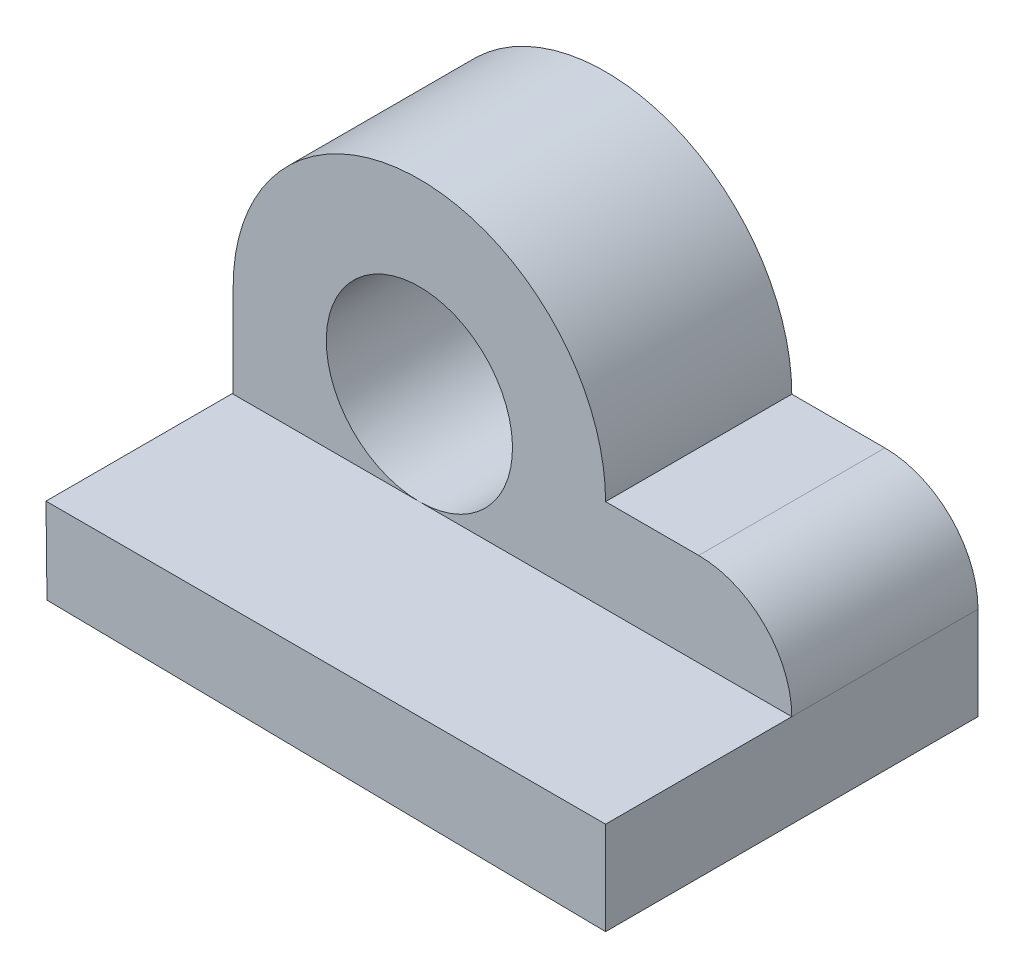
ISO-10303-21;
HEADER;
FILE_DESCRIPTION(('STEP AP214'),'2;1');
FILE_NAME('part.step','',(''),(''),'','','');
FILE_SCHEMA(('AUTOMOTIVE_DESIGN { 1 0 10303 214 1 1 1 1 }'));
ENDSEC;
DATA;
#1=APPLICATION_CONTEXT('core data for automotive mechanical design processes');
#2=APPLICATION_PROTOCOL_DEFINITION('international standard','automotive_design',2000,#1);
#3=PRODUCT_CONTEXT('',#1,'mechanical');
#4=PRODUCT('Part','Part','',(#3));
#5=PRODUCT_RELATED_PRODUCT_CATEGORY('part','',(#4));
#6=PRODUCT_DEFINITION_FORMATION('','',#4);
#7=PRODUCT_DEFINITION_CONTEXT('part definition',#1,'design');
#8=PRODUCT_DEFINITION('design','',#6,#7);
#9=PRODUCT_DEFINITION_SHAPE('','',#8);
#10=(LENGTH_UNIT() NAMED_UNIT(*) SI_UNIT(.MILLI.,.METRE.));
#11=(NAMED_UNIT(*) PLANE_ANGLE_UNIT() SI_UNIT($,.RADIAN.));
#12=(NAMED_UNIT(*) SI_UNIT($,.STERADIAN.) SOLID_ANGLE_UNIT());
#13=UNCERTAINTY_MEASURE_WITH_UNIT(LENGTH_MEASURE(1.E-05),#10,'distance_accuracy_value','');
#14=(GEOMETRIC_REPRESENTATION_CONTEXT(3) GLOBAL_UNCERTAINTY_ASSIGNED_CONTEXT((#13)) GLOBAL_UNIT_ASSIGNED_CONTEXT((#10,
#11,#12)) REPRESENTATION_CONTEXT('',''));
#15=CARTESIAN_POINT('',(0.,0.,0.));
#16=DIRECTION('',(0.,0.,1.));
#17=DIRECTION('',(1.,0.,0.));
#18=AXIS2_PLACEMENT_3D('',#15,#16,#17);
#19=CARTESIAN_POINT('',(0.,0.,20.));
#20=DIRECTION('',(0.,0.,1.));
#21=DIRECTION('',(1.,0.,0.));
#22=AXIS2_PLACEMENT_3D('',#19,#20,#21);
#23=PLANE('',#22);
#24=DIRECTION('',(-1.,0.,0.));
#25=VECTOR('',#24,1.);
#26=CARTESIAN_POINT('',(-20.1042367711844,-10.,20.));
#27=LINE('',#26,#25);
#28=CARTESIAN_POINT('',(40.,-10.0000000000001,20.));
#29=VERTEX_POINT('',#28);
#30=CARTESIAN_POINT('',(0.,-10.,20.));
#31=VERTEX_POINT('',#30);
#32=EDGE_CURVE('E50',#29,#31,#27,.T.);
#33=ORIENTED_EDGE('',*,*,#32,.F.);
#34=CARTESIAN_POINT('',(30.,-10.,20.));
#35=DIRECTION('',(0.,0.,1.));
#36=DIRECTION('',(1.,0.,0.));
#37=AXIS2_PLACEMENT_3D('',#34,#35,#36);
#38=CIRCLE('',#37,10.);
#39=CARTESIAN_POINT('',(29.9999999999999,0.,20.));
#40=VERTEX_POINT('',#39);
#41=EDGE_CURVE('E108',#29,#40,#38,.T.);
#42=ORIENTED_EDGE('',*,*,#41,.T.);
#43=DIRECTION('',(-1.,0.,0.));
#44=VECTOR('',#43,1.);
#45=CARTESIAN_POINT('',(20.,0.,20.));
#46=LINE('',#45,#44);
#47=CARTESIAN_POINT('',(20.,0.,20.));
#48=VERTEX_POINT('',#47);
#49=EDGE_CURVE('E64',#40,#48,#46,.T.);
#50=ORIENTED_EDGE('',*,*,#49,.T.);
#51=CARTESIAN_POINT('',(0.,0.,20.));
#52=DIRECTION('',(0.,0.,1.));
#53=DIRECTION('',(1.,0.,0.));
#54=AXIS2_PLACEMENT_3D('',#51,#52,#53);
#55=CIRCLE('',#54,20.);
#56=CARTESIAN_POINT('',(-20.,-1.39659253553725E-13,20.));
#57=VERTEX_POINT('',#56);
#58=EDGE_CURVE('E158',#48,#57,#55,.T.);
#59=ORIENTED_EDGE('',*,*,#58,.T.);
#60=DIRECTION('',(0.,-1.,0.));
#61=VECTOR('',#60,1.);
#62=CARTESIAN_POINT('',(-20.,-1.39659253553725E-13,20.));
#63=LINE('',#62,#61);
#64=CARTESIAN_POINT('',(-20.,-10.,20.));
#65=VERTEX_POINT('',#64);
#66=EDGE_CURVE('E99',#57,#65,#63,.T.);
#67=ORIENTED_EDGE('',*,*,#66,.T.);
#68=EDGE_CURVE('E11',#31,#65,#27,.T.);
#69=ORIENTED_EDGE('',*,*,#68,.F.);
#70=CARTESIAN_POINT('',(0.,0.,20.));
#71=DIRECTION('',(0.,0.,1.));
#72=DIRECTION('',(1.,0.,0.));
#73=AXIS2_PLACEMENT_3D('',#70,#71,#72);
#74=CIRCLE('',#73,10.);
#75=EDGE_CURVE('E110',#31,#31,#74,.T.);
#76=ORIENTED_EDGE('',*,*,#75,.F.);
#77=EDGE_LOOP('',(#33,#42,#50,#59,#67,#69,#76));
#78=FACE_BOUND('',#77,.T.);
#79=ADVANCED_FACE('F39',(#78),#23,.T.);
#80=CARTESIAN_POINT('',(0.,0.,0.));
#81=DIRECTION('',(0.,0.,1.));
#82=DIRECTION('',(1.,0.,0.));
#83=AXIS2_PLACEMENT_3D('',#80,#81,#82);
#84=PLANE('',#83);
#85=CARTESIAN_POINT('',(0.,0.,0.));
#86=DIRECTION('',(0.,0.,1.));
#87=DIRECTION('',(1.,0.,0.));
#88=AXIS2_PLACEMENT_3D('',#85,#86,#87);
#89=CIRCLE('',#88,20.);
#90=CARTESIAN_POINT('',(20.,0.,0.));
#91=VERTEX_POINT('',#90);
#92=CARTESIAN_POINT('',(-20.,-1.39659253553725E-13,0.));
#93=VERTEX_POINT('',#92);
#94=EDGE_CURVE('E154',#91,#93,#89,.T.);
#95=ORIENTED_EDGE('',*,*,#94,.F.);
#96=DIRECTION('',(-1.,0.,0.));
#97=VECTOR('',#96,1.);
#98=CARTESIAN_POINT('',(20.,0.,0.));
#99=LINE('',#98,#97);
#100=CARTESIAN_POINT('',(29.9999999999999,0.,0.));
#101=VERTEX_POINT('',#100);
#102=EDGE_CURVE('E91',#101,#91,#99,.T.);
#103=ORIENTED_EDGE('',*,*,#102,.F.);
#104=CARTESIAN_POINT('',(30.,-10.,0.));
#105=DIRECTION('',(0.,0.,1.));
#106=DIRECTION('',(1.,0.,0.));
#107=AXIS2_PLACEMENT_3D('',#104,#105,#106);
#108=CIRCLE('',#107,10.);
#109=CARTESIAN_POINT('',(40.,-10.0000000000001,0.));
#110=VERTEX_POINT('',#109);
#111=EDGE_CURVE('E178',#110,#101,#108,.T.);
#112=ORIENTED_EDGE('',*,*,#111,.F.);
#113=DIRECTION('',(0.,1.,0.));
#114=VECTOR('',#113,1.);
#115=CARTESIAN_POINT('',(40.,-10.0000000000001,0.));
#116=LINE('',#115,#114);
#117=CARTESIAN_POINT('',(40.,-20.,0.));
#118=VERTEX_POINT('',#117);
#119=EDGE_CURVE('E126',#118,#110,#116,.T.);
#120=ORIENTED_EDGE('',*,*,#119,.F.);
#121=DIRECTION('',(0.999902346639099,-0.0139748769448527,0.));
#122=VECTOR('',#121,1.);
#123=CARTESIAN_POINT('',(-20.,-19.1614254936899,0.));
#124=LINE('',#123,#122);
#125=CARTESIAN_POINT('',(-20.,-19.1614254936899,0.));
#126=VERTEX_POINT('',#125);
#127=EDGE_CURVE('E173',#126,#118,#124,.T.);
#128=ORIENTED_EDGE('',*,*,#127,.F.);
#129=DIRECTION('',(0.,-1.,0.));
#130=VECTOR('',#129,1.);
#131=CARTESIAN_POINT('',(-20.,-10.,0.));
#132=LINE('',#131,#130);
#133=EDGE_CURVE('E170',#93,#126,#132,.T.);
#134=ORIENTED_EDGE('',*,*,#133,.F.);
#135=EDGE_LOOP('',(#95,#103,#112,#120,#128,#134));
#136=FACE_BOUND('',#135,.T.);
#137=CARTESIAN_POINT('',(0.,0.,0.));
#138=DIRECTION('',(0.,0.,1.));
#139=DIRECTION('',(1.,0.,0.));
#140=AXIS2_PLACEMENT_3D('',#137,#138,#139);
#141=CIRCLE('',#140,10.);
#142=CARTESIAN_POINT('',(10.,0.,0.));
#143=VERTEX_POINT('',#142);
#144=EDGE_CURVE('E147',#143,#143,#141,.T.);
#145=ORIENTED_EDGE('',*,*,#144,.T.);
#146=EDGE_LOOP('',(#145));
#147=FACE_BOUND('',#146,.T.);
#148=ADVANCED_FACE('F200',(#136,#147),#84,.F.);
#149=CARTESIAN_POINT('',(0.,0.,20.));
#150=DIRECTION('',(0.,0.,-1.));
#151=DIRECTION('',(-1.,0.,0.));
#152=AXIS2_PLACEMENT_3D('',#149,#150,#151);
#153=CYLINDRICAL_SURFACE('',#152,20.);
#154=ORIENTED_EDGE('',*,*,#94,.T.);
#155=DIRECTION('',(0.,0.,-1.));
#156=VECTOR('',#155,1.);
#157=CARTESIAN_POINT('',(-20.,-1.39659253553725E-13,20.));
#158=LINE('',#157,#156);
#159=EDGE_CURVE('E43',#57,#93,#158,.T.);
#160=ORIENTED_EDGE('',*,*,#159,.F.);
#161=ORIENTED_EDGE('',*,*,#58,.F.);
#162=DIRECTION('',(0.,0.,-1.));
#163=VECTOR('',#162,1.);
#164=CARTESIAN_POINT('',(20.,0.,20.));
#165=LINE('',#164,#163);
#166=EDGE_CURVE('E166',#48,#91,#165,.T.);
#167=ORIENTED_EDGE('',*,*,#166,.T.);
#168=EDGE_LOOP('',(#154,#160,#161,#167));
#169=FACE_BOUND('',#168,.T.);
#170=ADVANCED_FACE('F41',(#169),#153,.T.);
#171=CARTESIAN_POINT('',(-20.,-10.,20.));
#172=DIRECTION('',(1.,0.,0.));
#173=DIRECTION('',(0.,0.,-1.));
#174=AXIS2_PLACEMENT_3D('',#171,#172,#173);
#175=PLANE('',#174);
#176=ORIENTED_EDGE('',*,*,#133,.T.);
#177=DIRECTION('',(0.,0.,-1.));
#178=VECTOR('',#177,1.);
#179=CARTESIAN_POINT('',(-20.,-19.1614254936899,20.));
#180=LINE('',#179,#178);
#181=CARTESIAN_POINT('',(-20.,-19.1614254936899,20.));
#182=VERTEX_POINT('',#181);
#183=EDGE_CURVE('E188',#182,#126,#180,.T.);
#184=ORIENTED_EDGE('',*,*,#183,.F.);
#185=EDGE_CURVE('E161',#65,#182,#63,.T.);
#186=ORIENTED_EDGE('',*,*,#185,.F.);
#187=ORIENTED_EDGE('',*,*,#66,.F.);
#188=ORIENTED_EDGE('',*,*,#159,.T.);
#189=EDGE_LOOP('',(#176,#184,#186,#187,#188));
#190=FACE_BOUND('',#189,.T.);
#191=ADVANCED_FACE('F195',(#190),#175,.F.);
#192=CARTESIAN_POINT('',(-20.,-19.1614254936899,20.));
#193=DIRECTION('',(0.0139748769448527,0.999902346639099,0.));
#194=DIRECTION('',(-0.999902346639099,0.0139748769448527,0.));
#195=AXIS2_PLACEMENT_3D('',#192,#193,#194);
#196=PLANE('',#195);
#197=ORIENTED_EDGE('',*,*,#127,.T.);
#198=DIRECTION('',(0.,0.,-1.));
#199=VECTOR('',#198,1.);
#200=CARTESIAN_POINT('',(40.,-20.,20.));
#201=LINE('',#200,#199);
#202=CARTESIAN_POINT('',(40.,-20.,40.));
#203=VERTEX_POINT('',#202);
#204=EDGE_CURVE('E130',#203,#118,#201,.T.);
#205=ORIENTED_EDGE('',*,*,#204,.F.);
#206=DIRECTION('',(0.999902346639099,-0.0139748769448527,0.));
#207=VECTOR('',#206,1.);
#208=CARTESIAN_POINT('',(-20.,-19.1614254936899,40.));
#209=LINE('',#208,#207);
#210=CARTESIAN_POINT('',(-20.,-19.1614254936899,40.));
#211=VERTEX_POINT('',#210);
#212=EDGE_CURVE('E213',#211,#203,#209,.T.);
#213=ORIENTED_EDGE('',*,*,#212,.F.);
#214=DIRECTION('',(0.,0.,-1.));
#215=VECTOR('',#214,1.);
#216=CARTESIAN_POINT('',(-20.,-19.1614254936899,40.));
#217=LINE('',#216,#215);
#218=EDGE_CURVE('E141',#211,#182,#217,.T.);
#219=ORIENTED_EDGE('',*,*,#218,.T.);
#220=ORIENTED_EDGE('',*,*,#183,.T.);
#221=EDGE_LOOP('',(#197,#205,#213,#219,#220));
#222=FACE_BOUND('',#221,.T.);
#223=ADVANCED_FACE('F203',(#222),#196,.F.);
#224=CARTESIAN_POINT('',(40.,-10.0000000000001,20.));
#225=DIRECTION('',(-1.,0.,0.));
#226=DIRECTION('',(0.,0.,1.));
#227=AXIS2_PLACEMENT_3D('',#224,#225,#226);
#228=PLANE('',#227);
#229=ORIENTED_EDGE('',*,*,#119,.T.);
#230=DIRECTION('',(0.,0.,-1.));
#231=VECTOR('',#230,1.);
#232=CARTESIAN_POINT('',(40.,-10.0000000000001,20.));
#233=LINE('',#232,#231);
#234=EDGE_CURVE('E118',#29,#110,#233,.T.);
#235=ORIENTED_EDGE('',*,*,#234,.F.);
#236=DIRECTION('',(0.,0.,-1.));
#237=VECTOR('',#236,1.);
#238=CARTESIAN_POINT('',(40.,-10.0000000000001,40.));
#239=LINE('',#238,#237);
#240=CARTESIAN_POINT('',(40.,-10.0000000000001,40.));
#241=VERTEX_POINT('',#240);
#242=EDGE_CURVE('E122',#241,#29,#239,.T.);
#243=ORIENTED_EDGE('',*,*,#242,.F.);
#244=DIRECTION('',(0.,1.,0.));
#245=VECTOR('',#244,1.);
#246=CARTESIAN_POINT('',(40.,-20.,40.));
#247=LINE('',#246,#245);
#248=EDGE_CURVE('E208',#203,#241,#247,.T.);
#249=ORIENTED_EDGE('',*,*,#248,.F.);
#250=ORIENTED_EDGE('',*,*,#204,.T.);
#251=EDGE_LOOP('',(#229,#235,#243,#249,#250));
#252=FACE_BOUND('',#251,.T.);
#253=ADVANCED_FACE('F119',(#252),#228,.F.);
#254=CARTESIAN_POINT('',(30.,-10.,20.));
#255=DIRECTION('',(0.,0.,-1.));
#256=DIRECTION('',(-1.,0.,0.));
#257=AXIS2_PLACEMENT_3D('',#254,#255,#256);
#258=CYLINDRICAL_SURFACE('',#257,10.);
#259=ORIENTED_EDGE('',*,*,#111,.T.);
#260=DIRECTION('',(0.,0.,-1.));
#261=VECTOR('',#260,1.);
#262=CARTESIAN_POINT('',(29.9999999999999,0.,20.));
#263=LINE('',#262,#261);
#264=EDGE_CURVE('E131',#40,#101,#263,.T.);
#265=ORIENTED_EDGE('',*,*,#264,.F.);
#266=ORIENTED_EDGE('',*,*,#41,.F.);
#267=ORIENTED_EDGE('',*,*,#234,.T.);
#268=EDGE_LOOP('',(#259,#265,#266,#267));
#269=FACE_BOUND('',#268,.T.);
#270=ADVANCED_FACE('F133',(#269),#258,.T.);
#271=CARTESIAN_POINT('',(20.,0.,20.));
#272=DIRECTION('',(0.,-1.,0.));
#273=DIRECTION('',(0.,0.,-1.));
#274=AXIS2_PLACEMENT_3D('',#271,#272,#273);
#275=PLANE('',#274);
#276=ORIENTED_EDGE('',*,*,#102,.T.);
#277=ORIENTED_EDGE('',*,*,#166,.F.);
#278=ORIENTED_EDGE('',*,*,#49,.F.);
#279=ORIENTED_EDGE('',*,*,#264,.T.);
#280=EDGE_LOOP('',(#276,#277,#278,#279));
#281=FACE_BOUND('',#280,.T.);
#282=ADVANCED_FACE('F261',(#281),#275,.F.);
#283=CARTESIAN_POINT('',(0.,0.,20.));
#284=DIRECTION('',(0.,0.,-1.));
#285=DIRECTION('',(-1.,0.,0.));
#286=AXIS2_PLACEMENT_3D('',#283,#284,#285);
#287=CYLINDRICAL_SURFACE('',#286,10.);
#288=ORIENTED_EDGE('',*,*,#75,.T.);
#289=EDGE_LOOP('',(#288));
#290=FACE_BOUND('',#289,.T.);
#291=ORIENTED_EDGE('',*,*,#144,.F.);
#292=EDGE_LOOP('',(#291));
#293=FACE_BOUND('',#292,.T.);
#294=ADVANCED_FACE('F258',(#290,#293),#287,.F.);
#295=CARTESIAN_POINT('',(0.,0.,20.));
#296=DIRECTION('',(0.,0.,1.));
#297=DIRECTION('',(1.,0.,0.));
#298=AXIS2_PLACEMENT_3D('',#295,#296,#297);
#299=PLANE('',#298);
#300=CARTESIAN_POINT('',(-20.1042367711844,-10.,20.));
#301=VERTEX_POINT('',#300);
#302=EDGE_CURVE('E51',#65,#301,#27,.T.);
#303=ORIENTED_EDGE('',*,*,#302,.F.);
#304=ORIENTED_EDGE('',*,*,#185,.T.);
#305=DIRECTION('',(0.0113770531641327,-0.999935279236262,0.));
#306=VECTOR('',#305,1.);
#307=CARTESIAN_POINT('',(-20.1042367711844,-10.,20.));
#308=LINE('',#307,#306);
#309=EDGE_CURVE('E221',#301,#182,#308,.T.);
#310=ORIENTED_EDGE('',*,*,#309,.F.);
#311=EDGE_LOOP('',(#303,#304,#310));
#312=FACE_BOUND('',#311,.T.);
#313=ADVANCED_FACE('F237',(#312),#299,.F.);
#314=CARTESIAN_POINT('',(-20.1042367711844,-10.,40.));
#315=DIRECTION('',(0.999935279236262,0.0113770531641327,0.));
#316=DIRECTION('',(-0.0113770531641327,0.999935279236262,0.));
#317=AXIS2_PLACEMENT_3D('',#314,#315,#316);
#318=PLANE('',#317);
#319=ORIENTED_EDGE('',*,*,#309,.T.);
#320=ORIENTED_EDGE('',*,*,#218,.F.);
#321=DIRECTION('',(0.0113770531641327,-0.999935279236262,0.));
#322=VECTOR('',#321,1.);
#323=CARTESIAN_POINT('',(-20.1042367711844,-10.,40.));
#324=LINE('',#323,#322);
#325=CARTESIAN_POINT('',(-20.1042367711844,-10.,40.));
#326=VERTEX_POINT('',#325);
#327=EDGE_CURVE('E114',#326,#211,#324,.T.);
#328=ORIENTED_EDGE('',*,*,#327,.F.);
#329=DIRECTION('',(0.,0.,-1.));
#330=VECTOR('',#329,1.);
#331=CARTESIAN_POINT('',(-20.1042367711844,-10.,40.));
#332=LINE('',#331,#330);
#333=EDGE_CURVE('E142',#326,#301,#332,.T.);
#334=ORIENTED_EDGE('',*,*,#333,.T.);
#335=EDGE_LOOP('',(#319,#320,#328,#334));
#336=FACE_BOUND('',#335,.T.);
#337=ADVANCED_FACE('F235',(#336),#318,.F.);
#338=CARTESIAN_POINT('',(-20.1042367711844,-10.,40.));
#339=DIRECTION('',(0.,-1.,0.));
#340=DIRECTION('',(1.,0.,0.));
#341=AXIS2_PLACEMENT_3D('',#338,#339,#340);
#342=PLANE('',#341);
#343=ORIENTED_EDGE('',*,*,#32,.T.);
#344=ORIENTED_EDGE('',*,*,#68,.T.);
#345=ORIENTED_EDGE('',*,*,#302,.T.);
#346=ORIENTED_EDGE('',*,*,#333,.F.);
#347=DIRECTION('',(-1.,0.,0.));
#348=VECTOR('',#347,1.);
#349=CARTESIAN_POINT('',(-20.1042367711844,-10.,40.));
#350=LINE('',#349,#348);
#351=EDGE_CURVE('E139',#241,#326,#350,.T.);
#352=ORIENTED_EDGE('',*,*,#351,.F.);
#353=ORIENTED_EDGE('',*,*,#242,.T.);
#354=EDGE_LOOP('',(#343,#344,#345,#346,#352,#353));
#355=FACE_BOUND('',#354,.T.);
#356=ADVANCED_FACE('F136',(#355),#342,.F.);
#357=CARTESIAN_POINT('',(0.,0.,40.));
#358=DIRECTION('',(0.,0.,1.));
#359=DIRECTION('',(1.,0.,0.));
#360=AXIS2_PLACEMENT_3D('',#357,#358,#359);
#361=PLANE('',#360);
#362=ORIENTED_EDGE('',*,*,#327,.T.);
#363=ORIENTED_EDGE('',*,*,#212,.T.);
#364=ORIENTED_EDGE('',*,*,#248,.T.);
#365=ORIENTED_EDGE('',*,*,#351,.T.);
#366=EDGE_LOOP('',(#362,#363,#364,#365));
#367=FACE_BOUND('',#366,.T.);
#368=ADVANCED_FACE('F242',(#367),#361,.T.);
#369=CLOSED_SHELL('',(#79,#148,#170,#191,#223,#253,#270,#282,#294,#313,#337,#356,#368));
#370=MANIFOLD_SOLID_BREP('B2',#369);
#371=ADVANCED_BREP_SHAPE_REPRESENTATION('',(#18,#370),#14);
#372=SHAPE_DEFINITION_REPRESENTATION(#9,#371);
ENDSEC;
END-ISO-10303-21;
